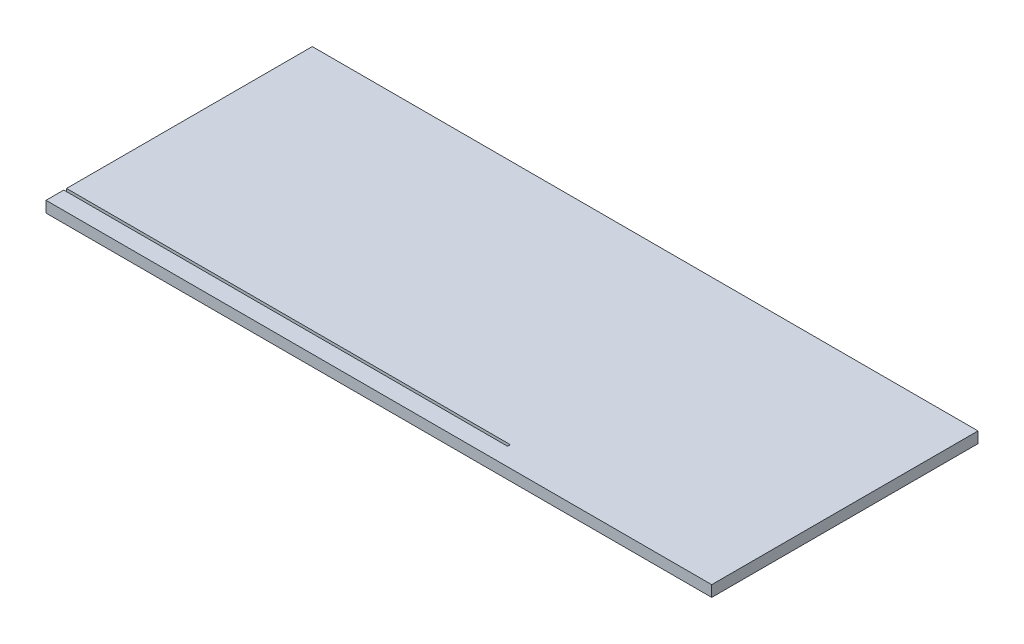
ISO-10303-21;
HEADER;
FILE_DESCRIPTION(('STEP AP214'),'2;1');
FILE_NAME('part.step','',(''),(''),'','','');
FILE_SCHEMA(('AUTOMOTIVE_DESIGN { 1 0 10303 214 1 1 1 1 }'));
ENDSEC;
DATA;
#1=APPLICATION_CONTEXT('core data for automotive mechanical design processes');
#2=APPLICATION_PROTOCOL_DEFINITION('international standard','automotive_design',2000,#1);
#3=PRODUCT_CONTEXT('',#1,'mechanical');
#4=PRODUCT('Part','Part','',(#3));
#5=PRODUCT_RELATED_PRODUCT_CATEGORY('part','',(#4));
#6=PRODUCT_DEFINITION_FORMATION('','',#4);
#7=PRODUCT_DEFINITION_CONTEXT('part definition',#1,'design');
#8=PRODUCT_DEFINITION('design','',#6,#7);
#9=PRODUCT_DEFINITION_SHAPE('','',#8);
#10=(LENGTH_UNIT() NAMED_UNIT(*) SI_UNIT(.MILLI.,.METRE.));
#11=(NAMED_UNIT(*) PLANE_ANGLE_UNIT() SI_UNIT($,.RADIAN.));
#12=(NAMED_UNIT(*) SI_UNIT($,.STERADIAN.) SOLID_ANGLE_UNIT());
#13=UNCERTAINTY_MEASURE_WITH_UNIT(LENGTH_MEASURE(1.E-05),#10,'distance_accuracy_value','');
#14=(GEOMETRIC_REPRESENTATION_CONTEXT(3) GLOBAL_UNCERTAINTY_ASSIGNED_CONTEXT((#13)) GLOBAL_UNIT_ASSIGNED_CONTEXT((#10,
#11,#12)) REPRESENTATION_CONTEXT('',''));
#15=CARTESIAN_POINT('',(0.,0.,0.));
#16=DIRECTION('',(0.,0.,1.));
#17=DIRECTION('',(1.,0.,0.));
#18=AXIS2_PLACEMENT_3D('',#15,#16,#17);
#19=CARTESIAN_POINT('',(0.,10.,0.));
#20=DIRECTION('',(1.,0.,0.));
#21=DIRECTION('',(0.,0.,-1.));
#22=AXIS2_PLACEMENT_3D('',#19,#20,#21);
#23=PLANE('',#22);
#24=DIRECTION('',(0.,0.,1.));
#25=VECTOR('',#24,1.);
#26=CARTESIAN_POINT('',(0.,10.,0.));
#27=LINE('',#26,#25);
#28=CARTESIAN_POINT('',(0.,10.,-16.));
#29=VERTEX_POINT('',#28);
#30=CARTESIAN_POINT('',(0.,10.,0.));
#31=VERTEX_POINT('',#30);
#32=EDGE_CURVE('E90',#29,#31,#27,.T.);
#33=ORIENTED_EDGE('',*,*,#32,.F.);
#34=DIRECTION('',(0.,1.,0.));
#35=VECTOR('',#34,1.);
#36=CARTESIAN_POINT('',(0.,7.5,-16.));
#37=LINE('',#36,#35);
#38=CARTESIAN_POINT('',(0.,7.5,-16.));
#39=VERTEX_POINT('',#38);
#40=EDGE_CURVE('E154',#39,#29,#37,.T.);
#41=ORIENTED_EDGE('',*,*,#40,.F.);
#42=DIRECTION('',(0.,0.,1.));
#43=VECTOR('',#42,1.);
#44=CARTESIAN_POINT('',(0.,7.5,-16.));
#45=LINE('',#44,#43);
#46=CARTESIAN_POINT('',(0.,7.5,-18.5));
#47=VERTEX_POINT('',#46);
#48=EDGE_CURVE('E130',#47,#39,#45,.T.);
#49=ORIENTED_EDGE('',*,*,#48,.F.);
#50=DIRECTION('',(0.,1.,0.));
#51=VECTOR('',#50,1.);
#52=CARTESIAN_POINT('',(0.,7.5,-18.5));
#53=LINE('',#52,#51);
#54=CARTESIAN_POINT('',(0.,10.,-18.5));
#55=VERTEX_POINT('',#54);
#56=EDGE_CURVE('E120',#47,#55,#53,.T.);
#57=ORIENTED_EDGE('',*,*,#56,.T.);
#58=CARTESIAN_POINT('',(0.,10.,-240.));
#59=VERTEX_POINT('',#58);
#60=EDGE_CURVE('E159',#59,#55,#27,.T.);
#61=ORIENTED_EDGE('',*,*,#60,.F.);
#62=DIRECTION('',(0.,-1.,0.));
#63=VECTOR('',#62,1.);
#64=CARTESIAN_POINT('',(0.,10.,-240.));
#65=LINE('',#64,#63);
#66=CARTESIAN_POINT('',(0.,0.,-240.));
#67=VERTEX_POINT('',#66);
#68=EDGE_CURVE('E170',#59,#67,#65,.T.);
#69=ORIENTED_EDGE('',*,*,#68,.T.);
#70=DIRECTION('',(0.,0.,1.));
#71=VECTOR('',#70,1.);
#72=CARTESIAN_POINT('',(0.,0.,0.));
#73=LINE('',#72,#71);
#74=CARTESIAN_POINT('',(0.,0.,0.));
#75=VERTEX_POINT('',#74);
#76=EDGE_CURVE('E153',#67,#75,#73,.T.);
#77=ORIENTED_EDGE('',*,*,#76,.T.);
#78=DIRECTION('',(0.,-1.,0.));
#79=VECTOR('',#78,1.);
#80=CARTESIAN_POINT('',(0.,10.,0.));
#81=LINE('',#80,#79);
#82=EDGE_CURVE('E11',#31,#75,#81,.T.);
#83=ORIENTED_EDGE('',*,*,#82,.F.);
#84=EDGE_LOOP('',(#33,#41,#49,#57,#61,#69,#77,#83));
#85=FACE_BOUND('',#84,.T.);
#86=ADVANCED_FACE('F38',(#85),#23,.F.);
#87=CARTESIAN_POINT('',(0.,10.,0.));
#88=DIRECTION('',(0.,0.,-1.));
#89=DIRECTION('',(-1.,0.,0.));
#90=AXIS2_PLACEMENT_3D('',#87,#88,#89);
#91=PLANE('',#90);
#92=DIRECTION('',(1.,0.,0.));
#93=VECTOR('',#92,1.);
#94=CARTESIAN_POINT('',(0.,0.,0.));
#95=LINE('',#94,#93);
#96=CARTESIAN_POINT('',(600.,0.,0.));
#97=VERTEX_POINT('',#96);
#98=EDGE_CURVE('E174',#75,#97,#95,.T.);
#99=ORIENTED_EDGE('',*,*,#98,.T.);
#100=DIRECTION('',(0.,-1.,0.));
#101=VECTOR('',#100,1.);
#102=CARTESIAN_POINT('',(600.,10.,0.));
#103=LINE('',#102,#101);
#104=CARTESIAN_POINT('',(600.,10.,0.));
#105=VERTEX_POINT('',#104);
#106=EDGE_CURVE('E46',#105,#97,#103,.T.);
#107=ORIENTED_EDGE('',*,*,#106,.F.);
#108=DIRECTION('',(1.,0.,0.));
#109=VECTOR('',#108,1.);
#110=CARTESIAN_POINT('',(0.,10.,0.));
#111=LINE('',#110,#109);
#112=EDGE_CURVE('E162',#31,#105,#111,.T.);
#113=ORIENTED_EDGE('',*,*,#112,.F.);
#114=ORIENTED_EDGE('',*,*,#82,.T.);
#115=EDGE_LOOP('',(#99,#107,#113,#114));
#116=FACE_BOUND('',#115,.T.);
#117=ADVANCED_FACE('F211',(#116),#91,.F.);
#118=CARTESIAN_POINT('',(600.,10.,0.));
#119=DIRECTION('',(-1.,0.,0.));
#120=DIRECTION('',(0.,0.,1.));
#121=AXIS2_PLACEMENT_3D('',#118,#119,#120);
#122=PLANE('',#121);
#123=DIRECTION('',(0.,0.,-1.));
#124=VECTOR('',#123,1.);
#125=CARTESIAN_POINT('',(600.,0.,0.));
#126=LINE('',#125,#124);
#127=CARTESIAN_POINT('',(600.,0.,-240.));
#128=VERTEX_POINT('',#127);
#129=EDGE_CURVE('E177',#97,#128,#126,.T.);
#130=ORIENTED_EDGE('',*,*,#129,.T.);
#131=DIRECTION('',(0.,-1.,0.));
#132=VECTOR('',#131,1.);
#133=CARTESIAN_POINT('',(600.,10.,-240.));
#134=LINE('',#133,#132);
#135=CARTESIAN_POINT('',(600.,10.,-240.));
#136=VERTEX_POINT('',#135);
#137=EDGE_CURVE('E184',#136,#128,#134,.T.);
#138=ORIENTED_EDGE('',*,*,#137,.F.);
#139=DIRECTION('',(0.,0.,-1.));
#140=VECTOR('',#139,1.);
#141=CARTESIAN_POINT('',(600.,10.,0.));
#142=LINE('',#141,#140);
#143=EDGE_CURVE('E165',#105,#136,#142,.T.);
#144=ORIENTED_EDGE('',*,*,#143,.F.);
#145=ORIENTED_EDGE('',*,*,#106,.T.);
#146=EDGE_LOOP('',(#130,#138,#144,#145));
#147=FACE_BOUND('',#146,.T.);
#148=ADVANCED_FACE('F192',(#147),#122,.F.);
#149=CARTESIAN_POINT('',(0.,10.,-240.));
#150=DIRECTION('',(0.,0.,1.));
#151=DIRECTION('',(1.,0.,0.));
#152=AXIS2_PLACEMENT_3D('',#149,#150,#151);
#153=PLANE('',#152);
#154=DIRECTION('',(-1.,0.,0.));
#155=VECTOR('',#154,1.);
#156=CARTESIAN_POINT('',(0.,0.,-240.));
#157=LINE('',#156,#155);
#158=EDGE_CURVE('E83',#128,#67,#157,.T.);
#159=ORIENTED_EDGE('',*,*,#158,.T.);
#160=ORIENTED_EDGE('',*,*,#68,.F.);
#161=DIRECTION('',(-1.,0.,0.));
#162=VECTOR('',#161,1.);
#163=CARTESIAN_POINT('',(0.,10.,-240.));
#164=LINE('',#163,#162);
#165=EDGE_CURVE('E62',#136,#59,#164,.T.);
#166=ORIENTED_EDGE('',*,*,#165,.F.);
#167=ORIENTED_EDGE('',*,*,#137,.T.);
#168=EDGE_LOOP('',(#159,#160,#166,#167));
#169=FACE_BOUND('',#168,.T.);
#170=ADVANCED_FACE('F201',(#169),#153,.F.);
#171=CARTESIAN_POINT('',(0.,10.,0.));
#172=DIRECTION('',(0.,-1.,0.));
#173=DIRECTION('',(0.,0.,-1.));
#174=AXIS2_PLACEMENT_3D('',#171,#172,#173);
#175=PLANE('',#174);
#176=DIRECTION('',(0.,0.,-1.));
#177=VECTOR('',#176,1.);
#178=CARTESIAN_POINT('',(400.,10.,-16.));
#179=LINE('',#178,#177);
#180=CARTESIAN_POINT('',(400.,10.,-16.));
#181=VERTEX_POINT('',#180);
#182=CARTESIAN_POINT('',(400.,10.,-18.5));
#183=VERTEX_POINT('',#182);
#184=EDGE_CURVE('E53',#181,#183,#179,.T.);
#185=ORIENTED_EDGE('',*,*,#184,.F.);
#186=DIRECTION('',(1.,0.,0.));
#187=VECTOR('',#186,1.);
#188=CARTESIAN_POINT('',(400.,10.,-16.));
#189=LINE('',#188,#187);
#190=EDGE_CURVE('E135',#29,#181,#189,.T.);
#191=ORIENTED_EDGE('',*,*,#190,.F.);
#192=ORIENTED_EDGE('',*,*,#32,.T.);
#193=ORIENTED_EDGE('',*,*,#112,.T.);
#194=ORIENTED_EDGE('',*,*,#143,.T.);
#195=ORIENTED_EDGE('',*,*,#165,.T.);
#196=ORIENTED_EDGE('',*,*,#60,.T.);
#197=DIRECTION('',(-1.,0.,0.));
#198=VECTOR('',#197,1.);
#199=CARTESIAN_POINT('',(400.,10.,-18.5));
#200=LINE('',#199,#198);
#201=EDGE_CURVE('E139',#183,#55,#200,.T.);
#202=ORIENTED_EDGE('',*,*,#201,.F.);
#203=EDGE_LOOP('',(#185,#191,#192,#193,#194,#195,#196,#202));
#204=FACE_BOUND('',#203,.T.);
#205=ADVANCED_FACE('F203',(#204),#175,.F.);
#206=CARTESIAN_POINT('',(0.,0.,0.));
#207=DIRECTION('',(0.,-1.,0.));
#208=DIRECTION('',(0.,0.,-1.));
#209=AXIS2_PLACEMENT_3D('',#206,#207,#208);
#210=PLANE('',#209);
#211=ORIENTED_EDGE('',*,*,#76,.F.);
#212=ORIENTED_EDGE('',*,*,#158,.F.);
#213=ORIENTED_EDGE('',*,*,#129,.F.);
#214=ORIENTED_EDGE('',*,*,#98,.F.);
#215=EDGE_LOOP('',(#211,#212,#213,#214));
#216=FACE_BOUND('',#215,.T.);
#217=ADVANCED_FACE('F197',(#216),#210,.T.);
#218=CARTESIAN_POINT('',(400.,7.5,-16.));
#219=DIRECTION('',(1.,0.,0.));
#220=DIRECTION('',(0.,0.,-1.));
#221=AXIS2_PLACEMENT_3D('',#218,#219,#220);
#222=PLANE('',#221);
#223=ORIENTED_EDGE('',*,*,#184,.T.);
#224=DIRECTION('',(0.,1.,0.));
#225=VECTOR('',#224,1.);
#226=CARTESIAN_POINT('',(400.,7.5,-18.5));
#227=LINE('',#226,#225);
#228=CARTESIAN_POINT('',(400.,7.5,-18.5));
#229=VERTEX_POINT('',#228);
#230=EDGE_CURVE('E111',#229,#183,#227,.T.);
#231=ORIENTED_EDGE('',*,*,#230,.F.);
#232=DIRECTION('',(0.,0.,-1.));
#233=VECTOR('',#232,1.);
#234=CARTESIAN_POINT('',(400.,7.5,-16.));
#235=LINE('',#234,#233);
#236=CARTESIAN_POINT('',(400.,7.5,-16.));
#237=VERTEX_POINT('',#236);
#238=EDGE_CURVE('E115',#237,#229,#235,.T.);
#239=ORIENTED_EDGE('',*,*,#238,.F.);
#240=DIRECTION('',(0.,1.,0.));
#241=VECTOR('',#240,1.);
#242=CARTESIAN_POINT('',(400.,7.5,-16.));
#243=LINE('',#242,#241);
#244=EDGE_CURVE('E150',#237,#181,#243,.T.);
#245=ORIENTED_EDGE('',*,*,#244,.T.);
#246=EDGE_LOOP('',(#223,#231,#239,#245));
#247=FACE_BOUND('',#246,.T.);
#248=ADVANCED_FACE('F113',(#247),#222,.F.);
#249=CARTESIAN_POINT('',(400.,7.5,-16.));
#250=DIRECTION('',(0.,0.,1.));
#251=DIRECTION('',(1.,0.,0.));
#252=AXIS2_PLACEMENT_3D('',#249,#250,#251);
#253=PLANE('',#252);
#254=ORIENTED_EDGE('',*,*,#190,.T.);
#255=ORIENTED_EDGE('',*,*,#244,.F.);
#256=DIRECTION('',(1.,0.,0.));
#257=VECTOR('',#256,1.);
#258=CARTESIAN_POINT('',(400.,7.5,-16.));
#259=LINE('',#258,#257);
#260=EDGE_CURVE('E121',#39,#237,#259,.T.);
#261=ORIENTED_EDGE('',*,*,#260,.F.);
#262=ORIENTED_EDGE('',*,*,#40,.T.);
#263=EDGE_LOOP('',(#254,#255,#261,#262));
#264=FACE_BOUND('',#263,.T.);
#265=ADVANCED_FACE('F223',(#264),#253,.F.);
#266=CARTESIAN_POINT('',(400.,7.5,-18.5));
#267=DIRECTION('',(0.,0.,-1.));
#268=DIRECTION('',(-1.,0.,0.));
#269=AXIS2_PLACEMENT_3D('',#266,#267,#268);
#270=PLANE('',#269);
#271=ORIENTED_EDGE('',*,*,#201,.T.);
#272=ORIENTED_EDGE('',*,*,#56,.F.);
#273=DIRECTION('',(-1.,0.,0.));
#274=VECTOR('',#273,1.);
#275=CARTESIAN_POINT('',(400.,7.5,-18.5));
#276=LINE('',#275,#274);
#277=EDGE_CURVE('E124',#229,#47,#276,.T.);
#278=ORIENTED_EDGE('',*,*,#277,.F.);
#279=ORIENTED_EDGE('',*,*,#230,.T.);
#280=EDGE_LOOP('',(#271,#272,#278,#279));
#281=FACE_BOUND('',#280,.T.);
#282=ADVANCED_FACE('F125',(#281),#270,.F.);
#283=CARTESIAN_POINT('',(0.,7.5,0.));
#284=DIRECTION('',(0.,1.,0.));
#285=DIRECTION('',(0.,0.,1.));
#286=AXIS2_PLACEMENT_3D('',#283,#284,#285);
#287=PLANE('',#286);
#288=ORIENTED_EDGE('',*,*,#238,.T.);
#289=ORIENTED_EDGE('',*,*,#277,.T.);
#290=ORIENTED_EDGE('',*,*,#48,.T.);
#291=ORIENTED_EDGE('',*,*,#260,.T.);
#292=EDGE_LOOP('',(#288,#289,#290,#291));
#293=FACE_BOUND('',#292,.T.);
#294=ADVANCED_FACE('F132',(#293),#287,.T.);
#295=CLOSED_SHELL('',(#86,#117,#148,#170,#205,#217,#248,#265,#282,#294));
#296=MANIFOLD_SOLID_BREP('B2',#295);
#297=ADVANCED_BREP_SHAPE_REPRESENTATION('',(#18,#296),#14);
#298=SHAPE_DEFINITION_REPRESENTATION(#9,#297);
ENDSEC;
END-ISO-10303-21;
